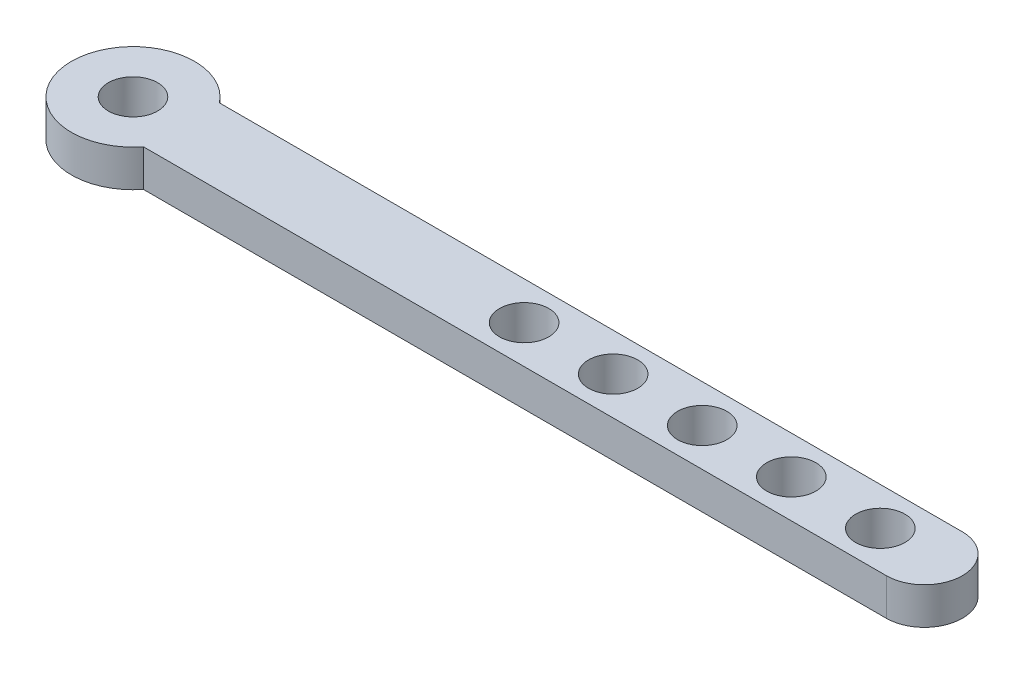
ISO-10303-21;
HEADER;
FILE_DESCRIPTION(('STEP AP214'),'2;1');
FILE_NAME('part.step','',(''),(''),'','','');
FILE_SCHEMA(('AUTOMOTIVE_DESIGN { 1 0 10303 214 1 1 1 1 }'));
ENDSEC;
DATA;
#1=APPLICATION_CONTEXT('core data for automotive mechanical design processes');
#2=APPLICATION_PROTOCOL_DEFINITION('international standard','automotive_design',2000,#1);
#3=PRODUCT_CONTEXT('',#1,'mechanical');
#4=PRODUCT('Part','Part','',(#3));
#5=PRODUCT_RELATED_PRODUCT_CATEGORY('part','',(#4));
#6=PRODUCT_DEFINITION_FORMATION('','',#4);
#7=PRODUCT_DEFINITION_CONTEXT('part definition',#1,'design');
#8=PRODUCT_DEFINITION('design','',#6,#7);
#9=PRODUCT_DEFINITION_SHAPE('','',#8);
#10=(LENGTH_UNIT() NAMED_UNIT(*) SI_UNIT(.MILLI.,.METRE.));
#11=(NAMED_UNIT(*) PLANE_ANGLE_UNIT() SI_UNIT($,.RADIAN.));
#12=(NAMED_UNIT(*) SI_UNIT($,.STERADIAN.) SOLID_ANGLE_UNIT());
#13=UNCERTAINTY_MEASURE_WITH_UNIT(LENGTH_MEASURE(1.E-05),#10,'distance_accuracy_value','');
#14=(GEOMETRIC_REPRESENTATION_CONTEXT(3) GLOBAL_UNCERTAINTY_ASSIGNED_CONTEXT((#13)) GLOBAL_UNIT_ASSIGNED_CONTEXT((#10,
#11,#12)) REPRESENTATION_CONTEXT('',''));
#15=CARTESIAN_POINT('',(0.,0.,0.));
#16=DIRECTION('',(0.,0.,1.));
#17=DIRECTION('',(1.,0.,0.));
#18=AXIS2_PLACEMENT_3D('',#15,#16,#17);
#19=CARTESIAN_POINT('',(32.1334036002285,3.,0.));
#20=DIRECTION('',(0.,-1.,0.));
#21=DIRECTION('',(0.,0.,-1.));
#22=AXIS2_PLACEMENT_3D('',#19,#20,#21);
#23=PLANE('',#22);
#24=CARTESIAN_POINT('',(-32.1334036002285,3.,0.));
#25=DIRECTION('',(0.,1.,0.));
#26=DIRECTION('',(0.,0.,1.));
#27=AXIS2_PLACEMENT_3D('',#24,#25,#26);
#28=CIRCLE('',#27,2.);
#29=CARTESIAN_POINT('',(-32.1334036002285,3.,2.));
#30=VERTEX_POINT('',#29);
#31=EDGE_CURVE('E165',#30,#30,#28,.T.);
#32=ORIENTED_EDGE('',*,*,#31,.F.);
#33=EDGE_LOOP('',(#32));
#34=FACE_BOUND('',#33,.T.);
#35=DIRECTION('',(-1.,0.,0.));
#36=VECTOR('',#35,1.);
#37=CARTESIAN_POINT('',(-32.1334036002285,3.,-3.08657349155645));
#38=LINE('',#37,#36);
#39=CARTESIAN_POINT('',(32.1334036002285,3.,-3.08657349155645));
#40=VERTEX_POINT('',#39);
#41=CARTESIAN_POINT('',(-28.199822015817,3.,-3.08657349155645));
#42=VERTEX_POINT('',#41);
#43=EDGE_CURVE('E115',#40,#42,#38,.T.);
#44=ORIENTED_EDGE('',*,*,#43,.T.);
#45=CARTESIAN_POINT('',(-32.1334036002285,3.,0.));
#46=DIRECTION('',(0.,1.,0.));
#47=DIRECTION('',(0.,0.,1.));
#48=AXIS2_PLACEMENT_3D('',#45,#46,#47);
#49=CIRCLE('',#48,5.);
#50=CARTESIAN_POINT('',(-28.199822015817,3.,3.08657349155645));
#51=VERTEX_POINT('',#50);
#52=EDGE_CURVE('E162',#42,#51,#49,.T.);
#53=ORIENTED_EDGE('',*,*,#52,.T.);
#54=DIRECTION('',(1.,0.,0.));
#55=VECTOR('',#54,1.);
#56=CARTESIAN_POINT('',(-32.1334036002285,3.,3.08657349155645));
#57=LINE('',#56,#55);
#58=CARTESIAN_POINT('',(32.1334036002285,3.,3.08657349155645));
#59=VERTEX_POINT('',#58);
#60=EDGE_CURVE('E64',#51,#59,#57,.T.);
#61=ORIENTED_EDGE('',*,*,#60,.T.);
#62=CARTESIAN_POINT('',(32.1334036002285,3.,0.));
#63=DIRECTION('',(0.,1.,0.));
#64=DIRECTION('',(0.,0.,-1.));
#65=AXIS2_PLACEMENT_3D('',#62,#63,#64);
#66=CIRCLE('',#65,3.08657349155645);
#67=EDGE_CURVE('E85',#59,#40,#66,.T.);
#68=ORIENTED_EDGE('',*,*,#67,.T.);
#69=EDGE_LOOP('',(#44,#53,#61,#68));
#70=FACE_BOUND('',#69,.T.);
#71=CARTESIAN_POINT('',(28.5587613316337,3.,0.));
#72=DIRECTION('',(0.,1.,0.));
#73=DIRECTION('',(0.,0.,1.));
#74=AXIS2_PLACEMENT_3D('',#71,#72,#73);
#75=CIRCLE('',#74,2.);
#76=CARTESIAN_POINT('',(28.5587613316337,3.,2.));
#77=VERTEX_POINT('',#76);
#78=EDGE_CURVE('E99',#77,#77,#75,.T.);
#79=ORIENTED_EDGE('',*,*,#78,.F.);
#80=EDGE_LOOP('',(#79));
#81=FACE_BOUND('',#80,.T.);
#82=CARTESIAN_POINT('',(21.3266834628092,3.,0.));
#83=DIRECTION('',(0.,1.,0.));
#84=DIRECTION('',(0.,0.,1.));
#85=AXIS2_PLACEMENT_3D('',#82,#83,#84);
#86=CIRCLE('',#85,2.);
#87=CARTESIAN_POINT('',(21.3266834628092,3.,2.00000000000005));
#88=VERTEX_POINT('',#87);
#89=EDGE_CURVE('E125',#88,#88,#86,.T.);
#90=ORIENTED_EDGE('',*,*,#89,.F.);
#91=EDGE_LOOP('',(#90));
#92=FACE_BOUND('',#91,.T.);
#93=CARTESIAN_POINT('',(14.0946055939847,3.,1.01002659680245E-13));
#94=DIRECTION('',(0.,1.,0.));
#95=DIRECTION('',(0.,0.,1.));
#96=AXIS2_PLACEMENT_3D('',#93,#94,#95);
#97=CIRCLE('',#96,2.);
#98=CARTESIAN_POINT('',(14.0946055939847,3.,2.0000000000001));
#99=VERTEX_POINT('',#98);
#100=EDGE_CURVE('E131',#99,#99,#97,.T.);
#101=ORIENTED_EDGE('',*,*,#100,.F.);
#102=EDGE_LOOP('',(#101));
#103=FACE_BOUND('',#102,.T.);
#104=CARTESIAN_POINT('',(6.86252772516023,3.,1.51503989520367E-13));
#105=DIRECTION('',(0.,1.,0.));
#106=DIRECTION('',(0.,0.,1.));
#107=AXIS2_PLACEMENT_3D('',#104,#105,#106);
#108=CIRCLE('',#107,2.);
#109=CARTESIAN_POINT('',(6.86252772516023,3.,2.00000000000015));
#110=VERTEX_POINT('',#109);
#111=EDGE_CURVE('E139',#110,#110,#108,.T.);
#112=ORIENTED_EDGE('',*,*,#111,.F.);
#113=EDGE_LOOP('',(#112));
#114=FACE_BOUND('',#113,.T.);
#115=CARTESIAN_POINT('',(-0.369550143664262,3.,2.02005319360489E-13));
#116=DIRECTION('',(0.,1.,0.));
#117=DIRECTION('',(0.,0.,1.));
#118=AXIS2_PLACEMENT_3D('',#115,#116,#117);
#119=CIRCLE('',#118,2.);
#120=CARTESIAN_POINT('',(-0.369550143664262,3.,2.0000000000002));
#121=VERTEX_POINT('',#120);
#122=EDGE_CURVE('E147',#121,#121,#119,.T.);
#123=ORIENTED_EDGE('',*,*,#122,.F.);
#124=EDGE_LOOP('',(#123));
#125=FACE_BOUND('',#124,.T.);
#126=ADVANCED_FACE('F39',(#34,#70,#81,#92,#103,#114,#125),#23,.F.);
#127=CARTESIAN_POINT('',(32.1334036002285,0.,0.));
#128=DIRECTION('',(0.,-1.,0.));
#129=DIRECTION('',(0.,0.,-1.));
#130=AXIS2_PLACEMENT_3D('',#127,#128,#129);
#131=PLANE('',#130);
#132=CARTESIAN_POINT('',(-32.1334036002285,0.,0.));
#133=DIRECTION('',(0.,-1.,0.));
#134=DIRECTION('',(0.,0.,-1.));
#135=AXIS2_PLACEMENT_3D('',#132,#133,#134);
#136=CIRCLE('',#135,2.);
#137=CARTESIAN_POINT('',(-32.1334036002285,0.,-2.));
#138=VERTEX_POINT('',#137);
#139=EDGE_CURVE('E43',#138,#138,#136,.T.);
#140=ORIENTED_EDGE('',*,*,#139,.F.);
#141=EDGE_LOOP('',(#140));
#142=FACE_BOUND('',#141,.T.);
#143=DIRECTION('',(1.,0.,0.));
#144=VECTOR('',#143,1.);
#145=CARTESIAN_POINT('',(-32.1334036002285,0.,3.08657349155645));
#146=LINE('',#145,#144);
#147=CARTESIAN_POINT('',(-28.199822015817,0.,3.08657349155645));
#148=VERTEX_POINT('',#147);
#149=CARTESIAN_POINT('',(32.1334036002285,0.,3.08657349155645));
#150=VERTEX_POINT('',#149);
#151=EDGE_CURVE('E77',#148,#150,#146,.T.);
#152=ORIENTED_EDGE('',*,*,#151,.F.);
#153=CARTESIAN_POINT('',(-32.1334036002285,0.,0.));
#154=DIRECTION('',(0.,-1.,0.));
#155=DIRECTION('',(0.,0.,-1.));
#156=AXIS2_PLACEMENT_3D('',#153,#154,#155);
#157=CIRCLE('',#156,5.);
#158=CARTESIAN_POINT('',(-28.199822015817,0.,-3.08657349155645));
#159=VERTEX_POINT('',#158);
#160=EDGE_CURVE('E56',#159,#148,#157,.F.);
#161=ORIENTED_EDGE('',*,*,#160,.F.);
#162=DIRECTION('',(-1.,0.,0.));
#163=VECTOR('',#162,1.);
#164=CARTESIAN_POINT('',(-32.1334036002285,0.,-3.08657349155645));
#165=LINE('',#164,#163);
#166=CARTESIAN_POINT('',(32.1334036002285,0.,-3.08657349155645));
#167=VERTEX_POINT('',#166);
#168=EDGE_CURVE('E86',#167,#159,#165,.T.);
#169=ORIENTED_EDGE('',*,*,#168,.F.);
#170=CARTESIAN_POINT('',(32.1334036002285,0.,0.));
#171=DIRECTION('',(0.,1.,0.));
#172=DIRECTION('',(0.,0.,-1.));
#173=AXIS2_PLACEMENT_3D('',#170,#171,#172);
#174=CIRCLE('',#173,3.08657349155645);
#175=EDGE_CURVE('E91',#150,#167,#174,.T.);
#176=ORIENTED_EDGE('',*,*,#175,.F.);
#177=EDGE_LOOP('',(#152,#161,#169,#176));
#178=FACE_BOUND('',#177,.T.);
#179=CARTESIAN_POINT('',(6.86252772516023,0.,1.51503989520367E-13));
#180=DIRECTION('',(0.,1.,0.));
#181=DIRECTION('',(0.,0.,1.));
#182=AXIS2_PLACEMENT_3D('',#179,#180,#181);
#183=CIRCLE('',#182,2.);
#184=CARTESIAN_POINT('',(6.86252772516023,0.,2.00000000000015));
#185=VERTEX_POINT('',#184);
#186=EDGE_CURVE('E143',#185,#185,#183,.T.);
#187=ORIENTED_EDGE('',*,*,#186,.T.);
#188=EDGE_LOOP('',(#187));
#189=FACE_BOUND('',#188,.T.);
#190=CARTESIAN_POINT('',(21.3266834628092,0.,0.));
#191=DIRECTION('',(0.,1.,0.));
#192=DIRECTION('',(0.,0.,1.));
#193=AXIS2_PLACEMENT_3D('',#190,#191,#192);
#194=CIRCLE('',#193,2.);
#195=CARTESIAN_POINT('',(21.3266834628092,0.,2.00000000000005));
#196=VERTEX_POINT('',#195);
#197=EDGE_CURVE('E127',#196,#196,#194,.T.);
#198=ORIENTED_EDGE('',*,*,#197,.T.);
#199=EDGE_LOOP('',(#198));
#200=FACE_BOUND('',#199,.T.);
#201=CARTESIAN_POINT('',(28.5587613316337,0.,0.));
#202=DIRECTION('',(0.,1.,0.));
#203=DIRECTION('',(0.,0.,1.));
#204=AXIS2_PLACEMENT_3D('',#201,#202,#203);
#205=CIRCLE('',#204,2.);
#206=CARTESIAN_POINT('',(28.5587613316337,0.,2.));
#207=VERTEX_POINT('',#206);
#208=EDGE_CURVE('E105',#207,#207,#205,.T.);
#209=ORIENTED_EDGE('',*,*,#208,.T.);
#210=EDGE_LOOP('',(#209));
#211=FACE_BOUND('',#210,.T.);
#212=CARTESIAN_POINT('',(14.0946055939847,0.,1.01002659680245E-13));
#213=DIRECTION('',(0.,1.,0.));
#214=DIRECTION('',(0.,0.,1.));
#215=AXIS2_PLACEMENT_3D('',#212,#213,#214);
#216=CIRCLE('',#215,2.);
#217=CARTESIAN_POINT('',(14.0946055939847,0.,2.0000000000001));
#218=VERTEX_POINT('',#217);
#219=EDGE_CURVE('E135',#218,#218,#216,.T.);
#220=ORIENTED_EDGE('',*,*,#219,.T.);
#221=EDGE_LOOP('',(#220));
#222=FACE_BOUND('',#221,.T.);
#223=CARTESIAN_POINT('',(-0.369550143664262,0.,2.02005319360489E-13));
#224=DIRECTION('',(0.,1.,0.));
#225=DIRECTION('',(0.,0.,1.));
#226=AXIS2_PLACEMENT_3D('',#223,#224,#225);
#227=CIRCLE('',#226,2.);
#228=CARTESIAN_POINT('',(-0.369550143664262,0.,2.0000000000002));
#229=VERTEX_POINT('',#228);
#230=EDGE_CURVE('E151',#229,#229,#227,.T.);
#231=ORIENTED_EDGE('',*,*,#230,.T.);
#232=EDGE_LOOP('',(#231));
#233=FACE_BOUND('',#232,.T.);
#234=ADVANCED_FACE('F94',(#142,#178,#189,#200,#211,#222,#233),#131,.T.);
#235=CARTESIAN_POINT('',(32.1334036002285,3.,0.));
#236=DIRECTION('',(0.,-1.,0.));
#237=DIRECTION('',(0.,0.,-1.));
#238=AXIS2_PLACEMENT_3D('',#235,#236,#237);
#239=CYLINDRICAL_SURFACE('',#238,3.08657349155645);
#240=ORIENTED_EDGE('',*,*,#175,.T.);
#241=DIRECTION('',(0.,-1.,0.));
#242=VECTOR('',#241,1.);
#243=CARTESIAN_POINT('',(32.1334036002285,3.,-3.08657349155645));
#244=LINE('',#243,#242);
#245=EDGE_CURVE('E49',#40,#167,#244,.T.);
#246=ORIENTED_EDGE('',*,*,#245,.F.);
#247=ORIENTED_EDGE('',*,*,#67,.F.);
#248=DIRECTION('',(0.,-1.,0.));
#249=VECTOR('',#248,1.);
#250=CARTESIAN_POINT('',(32.1334036002285,3.,3.08657349155645));
#251=LINE('',#250,#249);
#252=EDGE_CURVE('E80',#59,#150,#251,.T.);
#253=ORIENTED_EDGE('',*,*,#252,.T.);
#254=EDGE_LOOP('',(#240,#246,#247,#253));
#255=FACE_BOUND('',#254,.T.);
#256=ADVANCED_FACE('F41',(#255),#239,.T.);
#257=CARTESIAN_POINT('',(-32.1334036002285,3.,-3.08657349155645));
#258=DIRECTION('',(0.,0.,1.));
#259=DIRECTION('',(1.,0.,0.));
#260=AXIS2_PLACEMENT_3D('',#257,#258,#259);
#261=PLANE('',#260);
#262=ORIENTED_EDGE('',*,*,#168,.T.);
#263=DIRECTION('',(0.,1.,0.));
#264=VECTOR('',#263,1.);
#265=CARTESIAN_POINT('',(-28.199822015817,-14.142135623731,-3.08657349155645));
#266=LINE('',#265,#264);
#267=EDGE_CURVE('E117',#159,#42,#266,.T.);
#268=ORIENTED_EDGE('',*,*,#267,.T.);
#269=ORIENTED_EDGE('',*,*,#43,.F.);
#270=ORIENTED_EDGE('',*,*,#245,.T.);
#271=EDGE_LOOP('',(#262,#268,#269,#270));
#272=FACE_BOUND('',#271,.T.);
#273=ADVANCED_FACE('F112',(#272),#261,.F.);
#274=CARTESIAN_POINT('',(-32.1334036002285,3.,3.08657349155645));
#275=DIRECTION('',(0.,0.,-1.));
#276=DIRECTION('',(-1.,0.,0.));
#277=AXIS2_PLACEMENT_3D('',#274,#275,#276);
#278=PLANE('',#277);
#279=ORIENTED_EDGE('',*,*,#60,.F.);
#280=DIRECTION('',(0.,1.,0.));
#281=VECTOR('',#280,1.);
#282=CARTESIAN_POINT('',(-28.199822015817,-14.142135623731,3.08657349155645));
#283=LINE('',#282,#281);
#284=EDGE_CURVE('E11',#51,#148,#283,.F.);
#285=ORIENTED_EDGE('',*,*,#284,.T.);
#286=ORIENTED_EDGE('',*,*,#151,.T.);
#287=ORIENTED_EDGE('',*,*,#252,.F.);
#288=EDGE_LOOP('',(#279,#285,#286,#287));
#289=FACE_BOUND('',#288,.T.);
#290=ADVANCED_FACE('F79',(#289),#278,.F.);
#291=CARTESIAN_POINT('',(28.5587613316337,3.,0.));
#292=DIRECTION('',(0.,-1.,0.));
#293=DIRECTION('',(0.,0.,-1.));
#294=AXIS2_PLACEMENT_3D('',#291,#292,#293);
#295=CYLINDRICAL_SURFACE('',#294,2.);
#296=ORIENTED_EDGE('',*,*,#78,.T.);
#297=EDGE_LOOP('',(#296));
#298=FACE_BOUND('',#297,.T.);
#299=ORIENTED_EDGE('',*,*,#208,.F.);
#300=EDGE_LOOP('',(#299));
#301=FACE_BOUND('',#300,.T.);
#302=ADVANCED_FACE('F187',(#298,#301),#295,.F.);
#303=CARTESIAN_POINT('',(21.3266834628092,3.,0.));
#304=DIRECTION('',(0.,-1.,0.));
#305=DIRECTION('',(0.,0.,-1.));
#306=AXIS2_PLACEMENT_3D('',#303,#304,#305);
#307=CYLINDRICAL_SURFACE('',#306,2.);
#308=ORIENTED_EDGE('',*,*,#89,.T.);
#309=EDGE_LOOP('',(#308));
#310=FACE_BOUND('',#309,.T.);
#311=ORIENTED_EDGE('',*,*,#197,.F.);
#312=EDGE_LOOP('',(#311));
#313=FACE_BOUND('',#312,.T.);
#314=ADVANCED_FACE('F205',(#310,#313),#307,.F.);
#315=CARTESIAN_POINT('',(14.0946055939847,3.,1.01002659680245E-13));
#316=DIRECTION('',(0.,-1.,0.));
#317=DIRECTION('',(0.,0.,-1.));
#318=AXIS2_PLACEMENT_3D('',#315,#316,#317);
#319=CYLINDRICAL_SURFACE('',#318,2.);
#320=ORIENTED_EDGE('',*,*,#100,.T.);
#321=EDGE_LOOP('',(#320));
#322=FACE_BOUND('',#321,.T.);
#323=ORIENTED_EDGE('',*,*,#219,.F.);
#324=EDGE_LOOP('',(#323));
#325=FACE_BOUND('',#324,.T.);
#326=ADVANCED_FACE('F212',(#322,#325),#319,.F.);
#327=CARTESIAN_POINT('',(6.86252772516023,3.,1.51503989520367E-13));
#328=DIRECTION('',(0.,-1.,0.));
#329=DIRECTION('',(0.,0.,-1.));
#330=AXIS2_PLACEMENT_3D('',#327,#328,#329);
#331=CYLINDRICAL_SURFACE('',#330,2.);
#332=ORIENTED_EDGE('',*,*,#111,.T.);
#333=EDGE_LOOP('',(#332));
#334=FACE_BOUND('',#333,.T.);
#335=ORIENTED_EDGE('',*,*,#186,.F.);
#336=EDGE_LOOP('',(#335));
#337=FACE_BOUND('',#336,.T.);
#338=ADVANCED_FACE('F220',(#334,#337),#331,.F.);
#339=CARTESIAN_POINT('',(-0.369550143664262,3.,2.02005319360489E-13));
#340=DIRECTION('',(0.,-1.,0.));
#341=DIRECTION('',(0.,0.,-1.));
#342=AXIS2_PLACEMENT_3D('',#339,#340,#341);
#343=CYLINDRICAL_SURFACE('',#342,2.);
#344=ORIENTED_EDGE('',*,*,#122,.T.);
#345=EDGE_LOOP('',(#344));
#346=FACE_BOUND('',#345,.T.);
#347=ORIENTED_EDGE('',*,*,#230,.F.);
#348=EDGE_LOOP('',(#347));
#349=FACE_BOUND('',#348,.T.);
#350=ADVANCED_FACE('F228',(#346,#349),#343,.F.);
#351=CARTESIAN_POINT('',(-32.1334036002285,-14.142135623731,0.));
#352=DIRECTION('',(0.,1.,0.));
#353=DIRECTION('',(0.,0.,1.));
#354=AXIS2_PLACEMENT_3D('',#351,#352,#353);
#355=CYLINDRICAL_SURFACE('',#354,5.);
#356=ORIENTED_EDGE('',*,*,#267,.F.);
#357=ORIENTED_EDGE('',*,*,#160,.T.);
#358=ORIENTED_EDGE('',*,*,#284,.F.);
#359=ORIENTED_EDGE('',*,*,#52,.F.);
#360=EDGE_LOOP('',(#356,#357,#358,#359));
#361=FACE_BOUND('',#360,.T.);
#362=ADVANCED_FACE('F235',(#361),#355,.T.);
#363=CARTESIAN_POINT('',(-32.1334036002285,-7.,0.));
#364=DIRECTION('',(0.,1.,0.));
#365=DIRECTION('',(0.,0.,1.));
#366=AXIS2_PLACEMENT_3D('',#363,#364,#365);
#367=CYLINDRICAL_SURFACE('',#366,2.);
#368=ORIENTED_EDGE('',*,*,#139,.T.);
#369=EDGE_LOOP('',(#368));
#370=FACE_BOUND('',#369,.T.);
#371=ORIENTED_EDGE('',*,*,#31,.T.);
#372=EDGE_LOOP('',(#371));
#373=FACE_BOUND('',#372,.T.);
#374=ADVANCED_FACE('F174',(#370,#373),#367,.F.);
#375=CLOSED_SHELL('',(#126,#234,#256,#273,#290,#302,#314,#326,#338,#350,#362,#374));
#376=MANIFOLD_SOLID_BREP('B2',#375);
#377=ADVANCED_BREP_SHAPE_REPRESENTATION('',(#18,#376),#14);
#378=SHAPE_DEFINITION_REPRESENTATION(#9,#377);
ENDSEC;
END-ISO-10303-21;
